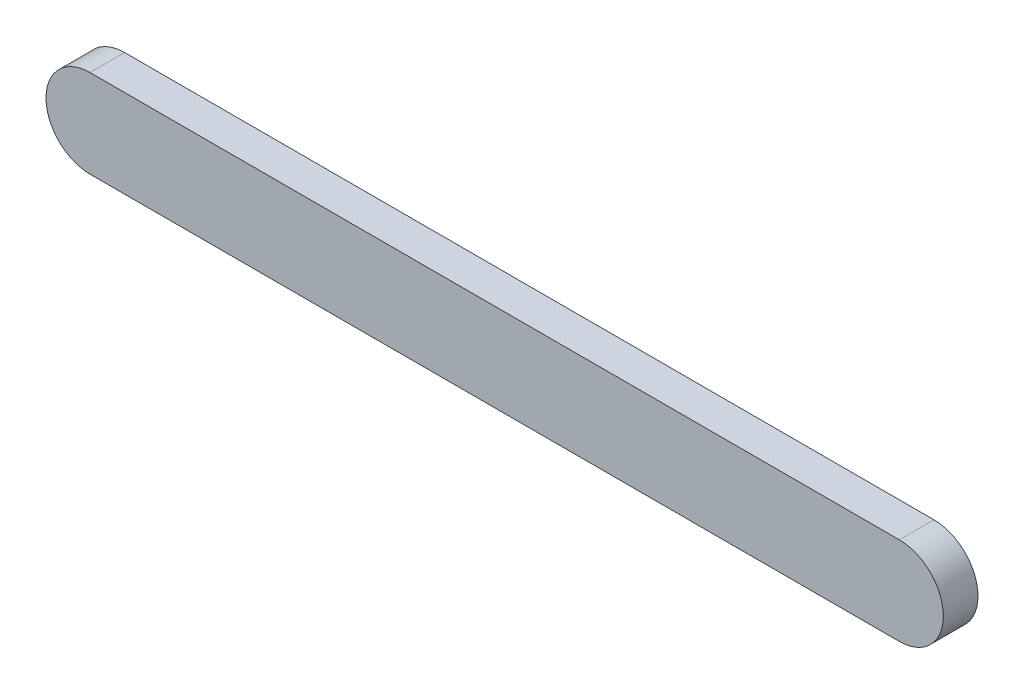
ISO-10303-21;
HEADER;
FILE_DESCRIPTION(('STEP AP214'),'2;1');
FILE_NAME('part.step','',(''),(''),'','','');
FILE_SCHEMA(('AUTOMOTIVE_DESIGN { 1 0 10303 214 1 1 1 1 }'));
ENDSEC;
DATA;
#1=APPLICATION_CONTEXT('core data for automotive mechanical design processes');
#2=APPLICATION_PROTOCOL_DEFINITION('international standard','automotive_design',2000,#1);
#3=PRODUCT_CONTEXT('',#1,'mechanical');
#4=PRODUCT('Part','Part','',(#3));
#5=PRODUCT_RELATED_PRODUCT_CATEGORY('part','',(#4));
#6=PRODUCT_DEFINITION_FORMATION('','',#4);
#7=PRODUCT_DEFINITION_CONTEXT('part definition',#1,'design');
#8=PRODUCT_DEFINITION('design','',#6,#7);
#9=PRODUCT_DEFINITION_SHAPE('','',#8);
#10=(LENGTH_UNIT() NAMED_UNIT(*) SI_UNIT(.MILLI.,.METRE.));
#11=(NAMED_UNIT(*) PLANE_ANGLE_UNIT() SI_UNIT($,.RADIAN.));
#12=(NAMED_UNIT(*) SI_UNIT($,.STERADIAN.) SOLID_ANGLE_UNIT());
#13=UNCERTAINTY_MEASURE_WITH_UNIT(LENGTH_MEASURE(1.E-05),#10,'distance_accuracy_value','');
#14=(GEOMETRIC_REPRESENTATION_CONTEXT(3) GLOBAL_UNCERTAINTY_ASSIGNED_CONTEXT((#13)) GLOBAL_UNIT_ASSIGNED_CONTEXT((#10,
#11,#12)) REPRESENTATION_CONTEXT('',''));
#15=CARTESIAN_POINT('',(0.,0.,0.));
#16=DIRECTION('',(0.,0.,1.));
#17=DIRECTION('',(1.,0.,0.));
#18=AXIS2_PLACEMENT_3D('',#15,#16,#17);
#19=CARTESIAN_POINT('',(111.3877376,119.1951388,0.));
#20=DIRECTION('',(0.,1.,0.));
#21=DIRECTION('',(1.,0.,0.));
#22=AXIS2_PLACEMENT_3D('',#19,#20,#21);
#23=PLANE('',#22);
#24=DIRECTION('',(1.,0.,0.));
#25=VECTOR('',#24,1.);
#26=CARTESIAN_POINT('',(111.3877376,119.1951388,0.1999996));
#27=LINE('',#26,#25);
#28=CARTESIAN_POINT('',(111.3877376,119.1951388,0.1999996));
#29=VERTEX_POINT('',#28);
#30=CARTESIAN_POINT('',(116.0596612,119.1951388,0.1999996));
#31=VERTEX_POINT('',#30);
#32=EDGE_CURVE('E11',#29,#31,#27,.T.);
#33=ORIENTED_EDGE('',*,*,#32,.F.);
#34=DIRECTION('',(0.,0.,1.));
#35=VECTOR('',#34,1.);
#36=CARTESIAN_POINT('',(111.3877376,119.1951388,0.));
#37=LINE('',#36,#35);
#38=CARTESIAN_POINT('',(111.3877376,119.1951388,0.));
#39=VERTEX_POINT('',#38);
#40=EDGE_CURVE('E24',#39,#29,#37,.T.);
#41=ORIENTED_EDGE('',*,*,#40,.F.);
#42=DIRECTION('',(1.,0.,0.));
#43=VECTOR('',#42,1.);
#44=CARTESIAN_POINT('',(111.3877376,119.1951388,0.));
#45=LINE('',#44,#43);
#46=CARTESIAN_POINT('',(116.0596612,119.1951388,0.));
#47=VERTEX_POINT('',#46);
#48=EDGE_CURVE('E75',#39,#47,#45,.T.);
#49=ORIENTED_EDGE('',*,*,#48,.T.);
#50=DIRECTION('',(0.,0.,1.));
#51=VECTOR('',#50,1.);
#52=CARTESIAN_POINT('',(116.0596612,119.1951388,0.));
#53=LINE('',#52,#51);
#54=EDGE_CURVE('E37',#47,#31,#53,.T.);
#55=ORIENTED_EDGE('',*,*,#54,.T.);
#56=EDGE_LOOP('',(#33,#41,#49,#55));
#57=FACE_BOUND('',#56,.T.);
#58=ADVANCED_FACE('F17',(#57),#23,.F.);
#59=CARTESIAN_POINT('',(116.0596612,119.4491388,0.));
#60=DIRECTION('',(0.,0.,-1.));
#61=DIRECTION('',(0.,-1.,0.));
#62=AXIS2_PLACEMENT_3D('',#59,#60,#61);
#63=CYLINDRICAL_SURFACE('',#62,0.253999999999995);
#64=CARTESIAN_POINT('',(116.0596612,119.4491388,0.1999996));
#65=DIRECTION('',(0.,0.,1.));
#66=DIRECTION('',(0.,-1.,0.));
#67=AXIS2_PLACEMENT_3D('',#64,#65,#66);
#68=CIRCLE('',#67,0.253999999999995);
#69=CARTESIAN_POINT('',(116.0596612,119.7031388,0.1999996));
#70=VERTEX_POINT('',#69);
#71=EDGE_CURVE('E83',#31,#70,#68,.T.);
#72=ORIENTED_EDGE('',*,*,#71,.F.);
#73=ORIENTED_EDGE('',*,*,#54,.F.);
#74=CARTESIAN_POINT('',(116.0596612,119.4491388,0.));
#75=DIRECTION('',(0.,0.,1.));
#76=DIRECTION('',(0.,-1.,0.));
#77=AXIS2_PLACEMENT_3D('',#74,#75,#76);
#78=CIRCLE('',#77,0.253999999999995);
#79=CARTESIAN_POINT('',(116.0596612,119.7031388,0.));
#80=VERTEX_POINT('',#79);
#81=EDGE_CURVE('E81',#47,#80,#78,.T.);
#82=ORIENTED_EDGE('',*,*,#81,.T.);
#83=DIRECTION('',(0.,0.,1.));
#84=VECTOR('',#83,1.);
#85=CARTESIAN_POINT('',(116.0596612,119.7031388,0.));
#86=LINE('',#85,#84);
#87=EDGE_CURVE('E67',#80,#70,#86,.T.);
#88=ORIENTED_EDGE('',*,*,#87,.T.);
#89=EDGE_LOOP('',(#72,#73,#82,#88));
#90=FACE_BOUND('',#89,.T.);
#91=ADVANCED_FACE('F89',(#90),#63,.T.);
#92=CARTESIAN_POINT('',(116.0596612,119.7031388,0.));
#93=DIRECTION('',(0.,-1.,0.));
#94=DIRECTION('',(-1.,0.,0.));
#95=AXIS2_PLACEMENT_3D('',#92,#93,#94);
#96=PLANE('',#95);
#97=DIRECTION('',(-1.,0.,0.));
#98=VECTOR('',#97,1.);
#99=CARTESIAN_POINT('',(116.0596612,119.7031388,0.1999996));
#100=LINE('',#99,#98);
#101=CARTESIAN_POINT('',(111.3877376,119.7031388,0.1999996));
#102=VERTEX_POINT('',#101);
#103=EDGE_CURVE('E71',#70,#102,#100,.T.);
#104=ORIENTED_EDGE('',*,*,#103,.F.);
#105=ORIENTED_EDGE('',*,*,#87,.F.);
#106=DIRECTION('',(-1.,0.,0.));
#107=VECTOR('',#106,1.);
#108=CARTESIAN_POINT('',(116.0596612,119.7031388,0.));
#109=LINE('',#108,#107);
#110=CARTESIAN_POINT('',(111.3877376,119.7031388,0.));
#111=VERTEX_POINT('',#110);
#112=EDGE_CURVE('E63',#80,#111,#109,.T.);
#113=ORIENTED_EDGE('',*,*,#112,.T.);
#114=DIRECTION('',(0.,0.,1.));
#115=VECTOR('',#114,1.);
#116=CARTESIAN_POINT('',(111.3877376,119.7031388,0.));
#117=LINE('',#116,#115);
#118=EDGE_CURVE('E53',#111,#102,#117,.T.);
#119=ORIENTED_EDGE('',*,*,#118,.T.);
#120=EDGE_LOOP('',(#104,#105,#113,#119));
#121=FACE_BOUND('',#120,.T.);
#122=ADVANCED_FACE('F66',(#121),#96,.F.);
#123=CARTESIAN_POINT('',(111.3877376,119.4491388,0.));
#124=DIRECTION('',(0.,0.,-1.));
#125=DIRECTION('',(0.,1.,0.));
#126=AXIS2_PLACEMENT_3D('',#123,#124,#125);
#127=CYLINDRICAL_SURFACE('',#126,0.254);
#128=CARTESIAN_POINT('',(111.3877376,119.4491388,0.1999996));
#129=DIRECTION('',(0.,0.,1.));
#130=DIRECTION('',(0.,1.,0.));
#131=AXIS2_PLACEMENT_3D('',#128,#129,#130);
#132=CIRCLE('',#131,0.254);
#133=EDGE_CURVE('E59',#102,#29,#132,.T.);
#134=ORIENTED_EDGE('',*,*,#133,.F.);
#135=ORIENTED_EDGE('',*,*,#118,.F.);
#136=CARTESIAN_POINT('',(111.3877376,119.4491388,0.));
#137=DIRECTION('',(0.,0.,1.));
#138=DIRECTION('',(0.,1.,0.));
#139=AXIS2_PLACEMENT_3D('',#136,#137,#138);
#140=CIRCLE('',#139,0.254);
#141=EDGE_CURVE('E57',#111,#39,#140,.T.);
#142=ORIENTED_EDGE('',*,*,#141,.T.);
#143=ORIENTED_EDGE('',*,*,#40,.T.);
#144=EDGE_LOOP('',(#134,#135,#142,#143));
#145=FACE_BOUND('',#144,.T.);
#146=ADVANCED_FACE('F55',(#145),#127,.T.);
#147=CARTESIAN_POINT('',(111.3877376,119.1951388,0.));
#148=DIRECTION('',(0.,0.,-1.));
#149=DIRECTION('',(-1.,0.,0.));
#150=AXIS2_PLACEMENT_3D('',#147,#148,#149);
#151=PLANE('',#150);
#152=ORIENTED_EDGE('',*,*,#141,.F.);
#153=ORIENTED_EDGE('',*,*,#112,.F.);
#154=ORIENTED_EDGE('',*,*,#81,.F.);
#155=ORIENTED_EDGE('',*,*,#48,.F.);
#156=EDGE_LOOP('',(#152,#153,#154,#155));
#157=FACE_BOUND('',#156,.T.);
#158=ADVANCED_FACE('F74',(#157),#151,.T.);
#159=CARTESIAN_POINT('',(111.3877376,119.1951388,0.1999996));
#160=DIRECTION('',(0.,0.,-1.));
#161=DIRECTION('',(-1.,0.,0.));
#162=AXIS2_PLACEMENT_3D('',#159,#160,#161);
#163=PLANE('',#162);
#164=ORIENTED_EDGE('',*,*,#32,.T.);
#165=ORIENTED_EDGE('',*,*,#71,.T.);
#166=ORIENTED_EDGE('',*,*,#103,.T.);
#167=ORIENTED_EDGE('',*,*,#133,.T.);
#168=EDGE_LOOP('',(#164,#165,#166,#167));
#169=FACE_BOUND('',#168,.T.);
#170=ADVANCED_FACE('F91',(#169),#163,.F.);
#171=CLOSED_SHELL('',(#58,#91,#122,#146,#158,#170));
#172=MANIFOLD_SOLID_BREP('B1',#171);
#173=ADVANCED_BREP_SHAPE_REPRESENTATION('',(#18,#172),#14);
#174=SHAPE_DEFINITION_REPRESENTATION(#9,#173);
ENDSEC;
END-ISO-10303-21;
